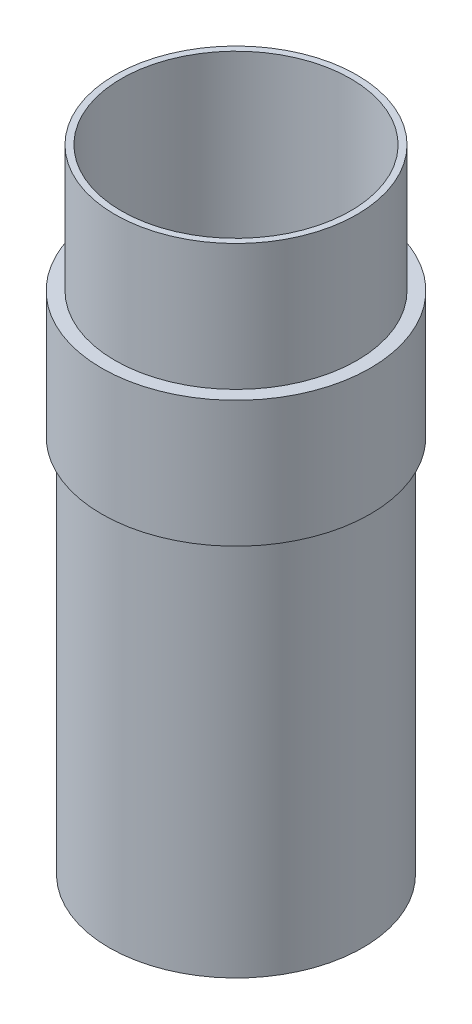
ISO-10303-21;
HEADER;
FILE_DESCRIPTION(('STEP AP214'),'2;1');
FILE_NAME('part.step','',(''),(''),'','','');
FILE_SCHEMA(('AUTOMOTIVE_DESIGN { 1 0 10303 214 1 1 1 1 }'));
ENDSEC;
DATA;
#1=APPLICATION_CONTEXT('core data for automotive mechanical design processes');
#2=APPLICATION_PROTOCOL_DEFINITION('international standard','automotive_design',2000,#1);
#3=PRODUCT_CONTEXT('',#1,'mechanical');
#4=PRODUCT('Part','Part','',(#3));
#5=PRODUCT_RELATED_PRODUCT_CATEGORY('part','',(#4));
#6=PRODUCT_DEFINITION_FORMATION('','',#4);
#7=PRODUCT_DEFINITION_CONTEXT('part definition',#1,'design');
#8=PRODUCT_DEFINITION('design','',#6,#7);
#9=PRODUCT_DEFINITION_SHAPE('','',#8);
#10=(LENGTH_UNIT() NAMED_UNIT(*) SI_UNIT(.MILLI.,.METRE.));
#11=(NAMED_UNIT(*) PLANE_ANGLE_UNIT() SI_UNIT($,.RADIAN.));
#12=(NAMED_UNIT(*) SI_UNIT($,.STERADIAN.) SOLID_ANGLE_UNIT());
#13=UNCERTAINTY_MEASURE_WITH_UNIT(LENGTH_MEASURE(1.E-05),#10,'distance_accuracy_value','');
#14=(GEOMETRIC_REPRESENTATION_CONTEXT(3) GLOBAL_UNCERTAINTY_ASSIGNED_CONTEXT((#13)) GLOBAL_UNIT_ASSIGNED_CONTEXT((#10,
#11,#12)) REPRESENTATION_CONTEXT('',''));
#15=CARTESIAN_POINT('',(0.,0.,0.));
#16=DIRECTION('',(0.,0.,1.));
#17=DIRECTION('',(1.,0.,0.));
#18=AXIS2_PLACEMENT_3D('',#15,#16,#17);
#19=CARTESIAN_POINT('',(0.,0.,0.));
#20=DIRECTION('',(0.,-1.,0.));
#21=DIRECTION('',(0.,0.,-1.));
#22=AXIS2_PLACEMENT_3D('',#19,#20,#21);
#23=CYLINDRICAL_SURFACE('',#22,24.3103124932719);
#24=CARTESIAN_POINT('',(0.,53.5615272883213,0.));
#25=DIRECTION('',(0.,-1.,0.));
#26=DIRECTION('',(0.,0.,-1.));
#27=AXIS2_PLACEMENT_3D('',#24,#25,#26);
#28=CIRCLE('',#27,24.3103124932719);
#29=CARTESIAN_POINT('',(0.,53.5615272883213,-24.3103124932719));
#30=VERTEX_POINT('',#29);
#31=EDGE_CURVE('E67',#30,#30,#28,.T.);
#32=ORIENTED_EDGE('',*,*,#31,.F.);
#33=EDGE_LOOP('',(#32));
#34=FACE_BOUND('',#33,.T.);
#35=CARTESIAN_POINT('',(0.,78.9615272883212,0.));
#36=DIRECTION('',(0.,-1.,0.));
#37=DIRECTION('',(0.,0.,-1.));
#38=AXIS2_PLACEMENT_3D('',#35,#36,#37);
#39=CIRCLE('',#38,24.3103124932719);
#40=CARTESIAN_POINT('',(0.,78.9615272883212,-24.3103124932719));
#41=VERTEX_POINT('',#40);
#42=EDGE_CURVE('E10',#41,#41,#39,.T.);
#43=ORIENTED_EDGE('',*,*,#42,.T.);
#44=EDGE_LOOP('',(#43));
#45=FACE_BOUND('',#44,.T.);
#46=ADVANCED_FACE('F39',(#34,#45),#23,.T.);
#47=CARTESIAN_POINT('',(0.,78.9615272883212,0.));
#48=DIRECTION('',(0.,-1.,0.));
#49=DIRECTION('',(0.,0.,-1.));
#50=AXIS2_PLACEMENT_3D('',#47,#48,#49);
#51=PLANE('',#50);
#52=ORIENTED_EDGE('',*,*,#42,.F.);
#53=EDGE_LOOP('',(#52));
#54=FACE_BOUND('',#53,.T.);
#55=CARTESIAN_POINT('',(0.,78.9615272883212,0.));
#56=DIRECTION('',(0.,-1.,0.));
#57=DIRECTION('',(0.,0.,-1.));
#58=AXIS2_PLACEMENT_3D('',#55,#56,#57);
#59=CIRCLE('',#58,23.0403124932719);
#60=CARTESIAN_POINT('',(0.,78.9615272883212,-23.0403124932719));
#61=VERTEX_POINT('',#60);
#62=EDGE_CURVE('E45',#61,#61,#59,.T.);
#63=ORIENTED_EDGE('',*,*,#62,.T.);
#64=EDGE_LOOP('',(#63));
#65=FACE_BOUND('',#64,.T.);
#66=ADVANCED_FACE('F74',(#54,#65),#51,.F.);
#67=CARTESIAN_POINT('',(0.,0.,0.));
#68=DIRECTION('',(0.,-1.,0.));
#69=DIRECTION('',(0.,0.,-1.));
#70=AXIS2_PLACEMENT_3D('',#67,#68,#69);
#71=CYLINDRICAL_SURFACE('',#70,23.0403124932719);
#72=CARTESIAN_POINT('',(0.,-48.0384727116786,0.));
#73=DIRECTION('',(0.,-1.,0.));
#74=DIRECTION('',(0.,0.,-1.));
#75=AXIS2_PLACEMENT_3D('',#72,#73,#74);
#76=CIRCLE('',#75,23.0403124932719);
#77=CARTESIAN_POINT('',(0.,-48.0384727116786,-23.0403124932719));
#78=VERTEX_POINT('',#77);
#79=EDGE_CURVE('E49',#78,#78,#76,.T.);
#80=ORIENTED_EDGE('',*,*,#79,.T.);
#81=EDGE_LOOP('',(#80));
#82=FACE_BOUND('',#81,.T.);
#83=ORIENTED_EDGE('',*,*,#62,.F.);
#84=EDGE_LOOP('',(#83));
#85=FACE_BOUND('',#84,.T.);
#86=ADVANCED_FACE('F78',(#82,#85),#71,.F.);
#87=CARTESIAN_POINT('',(0.,-48.0384727116786,0.));
#88=DIRECTION('',(0.,-1.,0.));
#89=DIRECTION('',(0.,0.,-1.));
#90=AXIS2_PLACEMENT_3D('',#87,#88,#89);
#91=PLANE('',#90);
#92=CARTESIAN_POINT('',(0.,-48.0384727116786,0.));
#93=DIRECTION('',(0.,-1.,0.));
#94=DIRECTION('',(0.,0.,-1.));
#95=AXIS2_PLACEMENT_3D('',#92,#93,#94);
#96=CIRCLE('',#95,25.5143000000001);
#97=CARTESIAN_POINT('',(0.,-48.0384727116786,-25.5143000000001));
#98=VERTEX_POINT('',#97);
#99=EDGE_CURVE('E53',#98,#98,#96,.T.);
#100=ORIENTED_EDGE('',*,*,#99,.T.);
#101=EDGE_LOOP('',(#100));
#102=FACE_BOUND('',#101,.T.);
#103=ORIENTED_EDGE('',*,*,#79,.F.);
#104=EDGE_LOOP('',(#103));
#105=FACE_BOUND('',#104,.T.);
#106=ADVANCED_FACE('F83',(#102,#105),#91,.T.);
#107=CARTESIAN_POINT('',(0.,0.,0.));
#108=DIRECTION('',(0.,-1.,0.));
#109=DIRECTION('',(0.,0.,-1.));
#110=AXIS2_PLACEMENT_3D('',#107,#108,#109);
#111=CYLINDRICAL_SURFACE('',#110,25.5143000000001);
#112=ORIENTED_EDGE('',*,*,#99,.F.);
#113=EDGE_LOOP('',(#112));
#114=FACE_BOUND('',#113,.T.);
#115=CARTESIAN_POINT('',(0.,28.1615272883214,0.));
#116=DIRECTION('',(0.,-1.,0.));
#117=DIRECTION('',(0.,0.,-1.));
#118=AXIS2_PLACEMENT_3D('',#115,#116,#117);
#119=CIRCLE('',#118,25.5143000000001);
#120=CARTESIAN_POINT('',(0.,28.1615272883214,-25.5143000000001));
#121=VERTEX_POINT('',#120);
#122=EDGE_CURVE('E58',#121,#121,#119,.T.);
#123=ORIENTED_EDGE('',*,*,#122,.T.);
#124=EDGE_LOOP('',(#123));
#125=FACE_BOUND('',#124,.T.);
#126=ADVANCED_FACE('F89',(#114,#125),#111,.T.);
#127=CARTESIAN_POINT('',(0.,28.1615272883214,0.));
#128=DIRECTION('',(0.,-1.,0.));
#129=DIRECTION('',(0.,0.,-1.));
#130=AXIS2_PLACEMENT_3D('',#127,#128,#129);
#131=PLANE('',#130);
#132=CARTESIAN_POINT('',(0.,28.1615272883214,0.));
#133=DIRECTION('',(0.,-1.,0.));
#134=DIRECTION('',(0.,0.,-1.));
#135=AXIS2_PLACEMENT_3D('',#132,#133,#134);
#136=CIRCLE('',#135,26.9875);
#137=CARTESIAN_POINT('',(0.,28.1615272883214,-26.9875));
#138=VERTEX_POINT('',#137);
#139=EDGE_CURVE('E61',#138,#138,#136,.T.);
#140=ORIENTED_EDGE('',*,*,#139,.T.);
#141=EDGE_LOOP('',(#140));
#142=FACE_BOUND('',#141,.T.);
#143=ORIENTED_EDGE('',*,*,#122,.F.);
#144=EDGE_LOOP('',(#143));
#145=FACE_BOUND('',#144,.T.);
#146=ADVANCED_FACE('F93',(#142,#145),#131,.T.);
#147=CARTESIAN_POINT('',(0.,0.,0.));
#148=DIRECTION('',(0.,-1.,0.));
#149=DIRECTION('',(0.,0.,-1.));
#150=AXIS2_PLACEMENT_3D('',#147,#148,#149);
#151=CYLINDRICAL_SURFACE('',#150,26.9875);
#152=ORIENTED_EDGE('',*,*,#139,.F.);
#153=EDGE_LOOP('',(#152));
#154=FACE_BOUND('',#153,.T.);
#155=CARTESIAN_POINT('',(0.,53.5615272883213,0.));
#156=DIRECTION('',(0.,-1.,0.));
#157=DIRECTION('',(0.,0.,-1.));
#158=AXIS2_PLACEMENT_3D('',#155,#156,#157);
#159=CIRCLE('',#158,26.9875);
#160=CARTESIAN_POINT('',(0.,53.5615272883213,-26.9875));
#161=VERTEX_POINT('',#160);
#162=EDGE_CURVE('E64',#161,#161,#159,.T.);
#163=ORIENTED_EDGE('',*,*,#162,.T.);
#164=EDGE_LOOP('',(#163));
#165=FACE_BOUND('',#164,.T.);
#166=ADVANCED_FACE('F97',(#154,#165),#151,.T.);
#167=CARTESIAN_POINT('',(0.,53.5615272883213,0.));
#168=DIRECTION('',(0.,-1.,0.));
#169=DIRECTION('',(0.,0.,-1.));
#170=AXIS2_PLACEMENT_3D('',#167,#168,#169);
#171=PLANE('',#170);
#172=ORIENTED_EDGE('',*,*,#162,.F.);
#173=EDGE_LOOP('',(#172));
#174=FACE_BOUND('',#173,.T.);
#175=ORIENTED_EDGE('',*,*,#31,.T.);
#176=EDGE_LOOP('',(#175));
#177=FACE_BOUND('',#176,.T.);
#178=ADVANCED_FACE('F71',(#174,#177),#171,.F.);
#179=CLOSED_SHELL('',(#46,#66,#86,#106,#126,#146,#166,#178));
#180=MANIFOLD_SOLID_BREP('B2',#179);
#181=ADVANCED_BREP_SHAPE_REPRESENTATION('',(#18,#180),#14);
#182=SHAPE_DEFINITION_REPRESENTATION(#9,#181);
ENDSEC;
END-ISO-10303-21;
